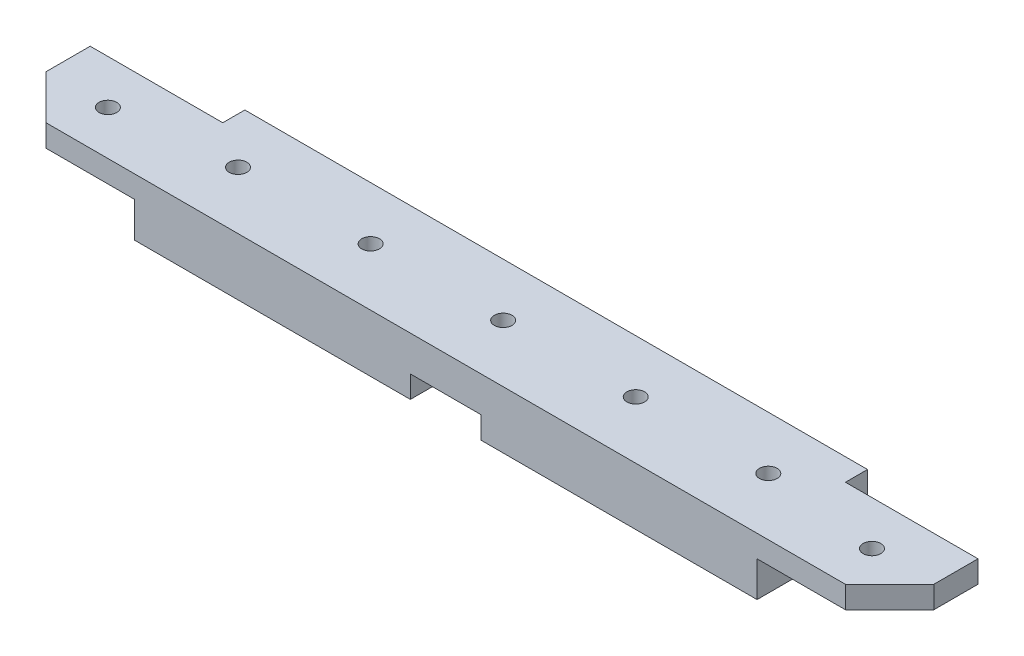
ISO-10303-21;
HEADER;
FILE_DESCRIPTION(('STEP AP214'),'2;1');
FILE_NAME('part.step','',(''),(''),'','','');
FILE_SCHEMA(('AUTOMOTIVE_DESIGN { 1 0 10303 214 1 1 1 1 }'));
ENDSEC;
DATA;
#1=APPLICATION_CONTEXT('core data for automotive mechanical design processes');
#2=APPLICATION_PROTOCOL_DEFINITION('international standard','automotive_design',2000,#1);
#3=PRODUCT_CONTEXT('',#1,'mechanical');
#4=PRODUCT('Part','Part','',(#3));
#5=PRODUCT_RELATED_PRODUCT_CATEGORY('part','',(#4));
#6=PRODUCT_DEFINITION_FORMATION('','',#4);
#7=PRODUCT_DEFINITION_CONTEXT('part definition',#1,'design');
#8=PRODUCT_DEFINITION('design','',#6,#7);
#9=PRODUCT_DEFINITION_SHAPE('','',#8);
#10=(LENGTH_UNIT() NAMED_UNIT(*) SI_UNIT(.MILLI.,.METRE.));
#11=(NAMED_UNIT(*) PLANE_ANGLE_UNIT() SI_UNIT($,.RADIAN.));
#12=(NAMED_UNIT(*) SI_UNIT($,.STERADIAN.) SOLID_ANGLE_UNIT());
#13=UNCERTAINTY_MEASURE_WITH_UNIT(LENGTH_MEASURE(1.E-05),#10,'distance_accuracy_value','');
#14=(GEOMETRIC_REPRESENTATION_CONTEXT(3) GLOBAL_UNCERTAINTY_ASSIGNED_CONTEXT((#13)) GLOBAL_UNIT_ASSIGNED_CONTEXT((#10,
#11,#12)) REPRESENTATION_CONTEXT('',''));
#15=CARTESIAN_POINT('',(0.,0.,0.));
#16=DIRECTION('',(0.,0.,1.));
#17=DIRECTION('',(1.,0.,0.));
#18=AXIS2_PLACEMENT_3D('',#15,#16,#17);
#19=CARTESIAN_POINT('',(70.46,-8.,-13.));
#20=DIRECTION('',(0.,1.,0.));
#21=DIRECTION('',(0.,0.,1.));
#22=AXIS2_PLACEMENT_3D('',#19,#20,#21);
#23=CYLINDRICAL_SURFACE('',#22,2.);
#24=CARTESIAN_POINT('',(70.46,5.,-13.));
#25=DIRECTION('',(0.,1.,0.));
#26=DIRECTION('',(0.,0.,1.));
#27=AXIS2_PLACEMENT_3D('',#24,#25,#26);
#28=CIRCLE('',#27,2.);
#29=CARTESIAN_POINT('',(70.46,5.,-11.));
#30=VERTEX_POINT('',#29);
#31=EDGE_CURVE('E255',#30,#30,#28,.T.);
#32=ORIENTED_EDGE('',*,*,#31,.T.);
#33=EDGE_LOOP('',(#32));
#34=FACE_BOUND('',#33,.T.);
#35=CARTESIAN_POINT('',(70.46,-3.,-13.));
#36=DIRECTION('',(0.,-1.,0.));
#37=DIRECTION('',(0.,0.,-1.));
#38=AXIS2_PLACEMENT_3D('',#35,#36,#37);
#39=CIRCLE('',#38,2.);
#40=CARTESIAN_POINT('',(70.46,-3.,-15.));
#41=VERTEX_POINT('',#40);
#42=EDGE_CURVE('E251',#41,#41,#39,.F.);
#43=ORIENTED_EDGE('',*,*,#42,.F.);
#44=EDGE_LOOP('',(#43));
#45=FACE_BOUND('',#44,.T.);
#46=ADVANCED_FACE('F43',(#34,#45),#23,.F.);
#47=CARTESIAN_POINT('',(130.46,-8.,-13.));
#48=DIRECTION('',(0.,1.,0.));
#49=DIRECTION('',(0.,0.,1.));
#50=AXIS2_PLACEMENT_3D('',#47,#48,#49);
#51=CYLINDRICAL_SURFACE('',#50,2.);
#52=CARTESIAN_POINT('',(130.46,5.,-13.));
#53=DIRECTION('',(0.,1.,0.));
#54=DIRECTION('',(0.,0.,-1.));
#55=AXIS2_PLACEMENT_3D('',#52,#53,#54);
#56=CIRCLE('',#55,2.);
#57=CARTESIAN_POINT('',(130.46,5.,-15.));
#58=VERTEX_POINT('',#57);
#59=EDGE_CURVE('E247',#58,#58,#56,.T.);
#60=ORIENTED_EDGE('',*,*,#59,.T.);
#61=EDGE_LOOP('',(#60));
#62=FACE_BOUND('',#61,.T.);
#63=CARTESIAN_POINT('',(130.46,-3.,-13.));
#64=DIRECTION('',(0.,-1.,0.));
#65=DIRECTION('',(0.,0.,-1.));
#66=AXIS2_PLACEMENT_3D('',#63,#64,#65);
#67=CIRCLE('',#66,2.);
#68=CARTESIAN_POINT('',(130.46,-3.,-15.));
#69=VERTEX_POINT('',#68);
#70=EDGE_CURVE('E347',#69,#69,#67,.F.);
#71=ORIENTED_EDGE('',*,*,#70,.F.);
#72=EDGE_LOOP('',(#71));
#73=FACE_BOUND('',#72,.T.);
#74=ADVANCED_FACE('F443',(#62,#73),#51,.F.);
#75=CARTESIAN_POINT('',(160.46,-8.,-13.));
#76=DIRECTION('',(0.,1.,0.));
#77=DIRECTION('',(0.,0.,1.));
#78=AXIS2_PLACEMENT_3D('',#75,#76,#77);
#79=CYLINDRICAL_SURFACE('',#78,2.);
#80=CARTESIAN_POINT('',(160.46,5.,-13.));
#81=DIRECTION('',(0.,1.,0.));
#82=DIRECTION('',(0.,0.,-1.));
#83=AXIS2_PLACEMENT_3D('',#80,#81,#82);
#84=CIRCLE('',#83,2.);
#85=CARTESIAN_POINT('',(160.46,5.,-15.));
#86=VERTEX_POINT('',#85);
#87=EDGE_CURVE('E250',#86,#86,#84,.T.);
#88=ORIENTED_EDGE('',*,*,#87,.T.);
#89=EDGE_LOOP('',(#88));
#90=FACE_BOUND('',#89,.T.);
#91=CARTESIAN_POINT('',(160.46,-3.,-13.));
#92=DIRECTION('',(0.,-1.,0.));
#93=DIRECTION('',(0.,0.,-1.));
#94=AXIS2_PLACEMENT_3D('',#91,#92,#93);
#95=CIRCLE('',#94,2.);
#96=CARTESIAN_POINT('',(160.46,-3.,-15.));
#97=VERTEX_POINT('',#96);
#98=EDGE_CURVE('E344',#97,#97,#95,.F.);
#99=ORIENTED_EDGE('',*,*,#98,.F.);
#100=EDGE_LOOP('',(#99));
#101=FACE_BOUND('',#100,.T.);
#102=ADVANCED_FACE('F450',(#90,#101),#79,.F.);
#103=CARTESIAN_POINT('',(40.46,-8.,-13.));
#104=DIRECTION('',(0.,1.,0.));
#105=DIRECTION('',(0.,0.,1.));
#106=AXIS2_PLACEMENT_3D('',#103,#104,#105);
#107=CYLINDRICAL_SURFACE('',#106,2.);
#108=CARTESIAN_POINT('',(40.46,5.,-13.));
#109=DIRECTION('',(0.,1.,0.));
#110=DIRECTION('',(0.,0.,1.));
#111=AXIS2_PLACEMENT_3D('',#108,#109,#110);
#112=CIRCLE('',#111,2.);
#113=CARTESIAN_POINT('',(40.46,5.,-11.));
#114=VERTEX_POINT('',#113);
#115=EDGE_CURVE('E252',#114,#114,#112,.T.);
#116=ORIENTED_EDGE('',*,*,#115,.T.);
#117=EDGE_LOOP('',(#116));
#118=FACE_BOUND('',#117,.T.);
#119=CARTESIAN_POINT('',(40.46,-3.,-13.));
#120=DIRECTION('',(0.,-1.,0.));
#121=DIRECTION('',(0.,0.,-1.));
#122=AXIS2_PLACEMENT_3D('',#119,#120,#121);
#123=CIRCLE('',#122,2.);
#124=CARTESIAN_POINT('',(40.46,-3.,-15.));
#125=VERTEX_POINT('',#124);
#126=EDGE_CURVE('E244',#125,#125,#123,.F.);
#127=ORIENTED_EDGE('',*,*,#126,.F.);
#128=EDGE_LOOP('',(#127));
#129=FACE_BOUND('',#128,.T.);
#130=ADVANCED_FACE('F474',(#118,#129),#107,.F.);
#131=CARTESIAN_POINT('',(0.,0.,0.));
#132=DIRECTION('',(0.,-1.,0.));
#133=DIRECTION('',(0.,0.,-1.));
#134=AXIS2_PLACEMENT_3D('',#131,#132,#133);
#135=PLANE('',#134);
#136=CARTESIAN_POINT('',(14.,0.,-10.));
#137=DIRECTION('',(0.,1.,0.));
#138=DIRECTION('',(0.,0.,1.));
#139=AXIS2_PLACEMENT_3D('',#136,#137,#138);
#140=CIRCLE('',#139,2.);
#141=CARTESIAN_POINT('',(14.,0.,-8.));
#142=VERTEX_POINT('',#141);
#143=EDGE_CURVE('E286',#142,#142,#140,.T.);
#144=ORIENTED_EDGE('',*,*,#143,.T.);
#145=EDGE_LOOP('',(#144));
#146=FACE_BOUND('',#145,.T.);
#147=DIRECTION('',(1.,0.,0.));
#148=VECTOR('',#147,1.);
#149=CARTESIAN_POINT('',(0.,0.,0.));
#150=LINE('',#149,#148);
#151=CARTESIAN_POINT('',(10.,0.,0.));
#152=VERTEX_POINT('',#151);
#153=CARTESIAN_POINT('',(30.,0.,0.));
#154=VERTEX_POINT('',#153);
#155=EDGE_CURVE('E320',#152,#154,#150,.T.);
#156=ORIENTED_EDGE('',*,*,#155,.F.);
#157=DIRECTION('',(0.707106781186547,0.,0.707106781186549));
#158=VECTOR('',#157,1.);
#159=CARTESIAN_POINT('',(5.00000000000002,0.,-5.00000000000001));
#160=LINE('',#159,#158);
#161=CARTESIAN_POINT('',(0.,0.,-10.));
#162=VERTEX_POINT('',#161);
#163=EDGE_CURVE('E52',#152,#162,#160,.F.);
#164=ORIENTED_EDGE('',*,*,#163,.T.);
#165=DIRECTION('',(0.,0.,1.));
#166=VECTOR('',#165,1.);
#167=CARTESIAN_POINT('',(0.,0.,0.));
#168=LINE('',#167,#166);
#169=CARTESIAN_POINT('',(0.,0.,-20.));
#170=VERTEX_POINT('',#169);
#171=EDGE_CURVE('E289',#170,#162,#168,.T.);
#172=ORIENTED_EDGE('',*,*,#171,.F.);
#173=DIRECTION('',(-1.,0.,0.));
#174=VECTOR('',#173,1.);
#175=CARTESIAN_POINT('',(0.,0.,-20.));
#176=LINE('',#175,#174);
#177=CARTESIAN_POINT('',(30.,0.,-20.));
#178=VERTEX_POINT('',#177);
#179=EDGE_CURVE('E302',#178,#170,#176,.T.);
#180=ORIENTED_EDGE('',*,*,#179,.F.);
#181=DIRECTION('',(0.,0.,1.));
#182=VECTOR('',#181,1.);
#183=CARTESIAN_POINT('',(30.,0.,-25.));
#184=LINE('',#183,#182);
#185=EDGE_CURVE('E275',#178,#154,#184,.T.);
#186=ORIENTED_EDGE('',*,*,#185,.T.);
#187=EDGE_LOOP('',(#156,#164,#172,#180,#186));
#188=FACE_BOUND('',#187,.T.);
#189=ADVANCED_FACE('F418',(#146,#188),#135,.T.);
#190=CARTESIAN_POINT('',(186.92,0.,-10.));
#191=DIRECTION('',(0.,1.,0.));
#192=DIRECTION('',(0.,0.,1.));
#193=AXIS2_PLACEMENT_3D('',#190,#191,#192);
#194=CIRCLE('',#193,2.);
#195=CARTESIAN_POINT('',(186.92,0.,-8.));
#196=VERTEX_POINT('',#195);
#197=EDGE_CURVE('E293',#196,#196,#194,.T.);
#198=ORIENTED_EDGE('',*,*,#197,.T.);
#199=EDGE_LOOP('',(#198));
#200=FACE_BOUND('',#199,.T.);
#201=DIRECTION('',(0.,0.,-1.));
#202=VECTOR('',#201,1.);
#203=CARTESIAN_POINT('',(200.92,0.,0.));
#204=LINE('',#203,#202);
#205=CARTESIAN_POINT('',(200.92,0.,-10.));
#206=VERTEX_POINT('',#205);
#207=CARTESIAN_POINT('',(200.92,0.,-20.));
#208=VERTEX_POINT('',#207);
#209=EDGE_CURVE('E322',#206,#208,#204,.T.);
#210=ORIENTED_EDGE('',*,*,#209,.F.);
#211=DIRECTION('',(0.707106781186549,0.,-0.707106781186547));
#212=VECTOR('',#211,1.);
#213=CARTESIAN_POINT('',(95.4599999999997,0.,95.46));
#214=LINE('',#213,#212);
#215=CARTESIAN_POINT('',(190.92,0.,0.));
#216=VERTEX_POINT('',#215);
#217=EDGE_CURVE('E354',#206,#216,#214,.F.);
#218=ORIENTED_EDGE('',*,*,#217,.T.);
#219=CARTESIAN_POINT('',(170.92,0.,0.));
#220=VERTEX_POINT('',#219);
#221=EDGE_CURVE('E319',#220,#216,#150,.T.);
#222=ORIENTED_EDGE('',*,*,#221,.F.);
#223=DIRECTION('',(0.,0.,-1.));
#224=VECTOR('',#223,1.);
#225=CARTESIAN_POINT('',(170.92,0.,-25.));
#226=LINE('',#225,#224);
#227=CARTESIAN_POINT('',(170.92,0.,-20.));
#228=VERTEX_POINT('',#227);
#229=EDGE_CURVE('E260',#220,#228,#226,.T.);
#230=ORIENTED_EDGE('',*,*,#229,.T.);
#231=DIRECTION('',(-1.,0.,0.));
#232=VECTOR('',#231,1.);
#233=CARTESIAN_POINT('',(170.92,0.,-20.));
#234=LINE('',#233,#232);
#235=EDGE_CURVE('E324',#208,#228,#234,.T.);
#236=ORIENTED_EDGE('',*,*,#235,.F.);
#237=EDGE_LOOP('',(#210,#218,#222,#230,#236));
#238=FACE_BOUND('',#237,.T.);
#239=ADVANCED_FACE('F381',(#200,#238),#135,.T.);
#240=CARTESIAN_POINT('',(0.,5.,0.));
#241=DIRECTION('',(1.,0.,0.));
#242=DIRECTION('',(0.,0.,-1.));
#243=AXIS2_PLACEMENT_3D('',#240,#241,#242);
#244=PLANE('',#243);
#245=ORIENTED_EDGE('',*,*,#171,.T.);
#246=DIRECTION('',(0.,1.,0.));
#247=VECTOR('',#246,1.);
#248=CARTESIAN_POINT('',(0.,5.,-10.));
#249=LINE('',#248,#247);
#250=CARTESIAN_POINT('',(0.,5.,-10.));
#251=VERTEX_POINT('',#250);
#252=EDGE_CURVE('E11',#162,#251,#249,.T.);
#253=ORIENTED_EDGE('',*,*,#252,.T.);
#254=DIRECTION('',(0.,0.,1.));
#255=VECTOR('',#254,1.);
#256=CARTESIAN_POINT('',(0.,5.,0.));
#257=LINE('',#256,#255);
#258=CARTESIAN_POINT('',(0.,5.,-20.));
#259=VERTEX_POINT('',#258);
#260=EDGE_CURVE('E298',#259,#251,#257,.T.);
#261=ORIENTED_EDGE('',*,*,#260,.F.);
#262=DIRECTION('',(0.,-1.,0.));
#263=VECTOR('',#262,1.);
#264=CARTESIAN_POINT('',(0.,5.,-20.));
#265=LINE('',#264,#263);
#266=EDGE_CURVE('E317',#259,#170,#265,.T.);
#267=ORIENTED_EDGE('',*,*,#266,.T.);
#268=EDGE_LOOP('',(#245,#253,#261,#267));
#269=FACE_BOUND('',#268,.T.);
#270=ADVANCED_FACE('F414',(#269),#244,.F.);
#271=CARTESIAN_POINT('',(0.,5.,0.));
#272=DIRECTION('',(0.,0.,-1.));
#273=DIRECTION('',(-1.,0.,0.));
#274=AXIS2_PLACEMENT_3D('',#271,#272,#273);
#275=PLANE('',#274);
#276=DIRECTION('',(1.,0.,0.));
#277=VECTOR('',#276,1.);
#278=CARTESIAN_POINT('',(30.,-8.,0.));
#279=LINE('',#278,#277);
#280=CARTESIAN_POINT('',(30.,-8.,0.));
#281=VERTEX_POINT('',#280);
#282=CARTESIAN_POINT('',(92.46,-8.,0.));
#283=VERTEX_POINT('',#282);
#284=EDGE_CURVE('E265',#281,#283,#279,.T.);
#285=ORIENTED_EDGE('',*,*,#284,.T.);
#286=DIRECTION('',(0.,-1.,0.));
#287=VECTOR('',#286,1.);
#288=CARTESIAN_POINT('',(92.46,-3.,0.));
#289=LINE('',#288,#287);
#290=CARTESIAN_POINT('',(92.46,-3.,0.));
#291=VERTEX_POINT('',#290);
#292=EDGE_CURVE('E215',#291,#283,#289,.T.);
#293=ORIENTED_EDGE('',*,*,#292,.F.);
#294=DIRECTION('',(-1.,0.,0.));
#295=VECTOR('',#294,1.);
#296=CARTESIAN_POINT('',(92.46,-3.,0.));
#297=LINE('',#296,#295);
#298=CARTESIAN_POINT('',(108.46,-3.,0.));
#299=VERTEX_POINT('',#298);
#300=EDGE_CURVE('E201',#299,#291,#297,.T.);
#301=ORIENTED_EDGE('',*,*,#300,.F.);
#302=DIRECTION('',(0.,-1.,0.));
#303=VECTOR('',#302,1.);
#304=CARTESIAN_POINT('',(108.46,-3.,0.));
#305=LINE('',#304,#303);
#306=CARTESIAN_POINT('',(108.46,-8.,0.));
#307=VERTEX_POINT('',#306);
#308=EDGE_CURVE('E217',#299,#307,#305,.T.);
#309=ORIENTED_EDGE('',*,*,#308,.T.);
#310=CARTESIAN_POINT('',(170.92,-8.,0.));
#311=VERTEX_POINT('',#310);
#312=EDGE_CURVE('E264',#307,#311,#279,.T.);
#313=ORIENTED_EDGE('',*,*,#312,.T.);
#314=DIRECTION('',(0.,1.,0.));
#315=VECTOR('',#314,1.);
#316=CARTESIAN_POINT('',(170.92,-8.,0.));
#317=LINE('',#316,#315);
#318=EDGE_CURVE('E281',#311,#220,#317,.T.);
#319=ORIENTED_EDGE('',*,*,#318,.T.);
#320=ORIENTED_EDGE('',*,*,#221,.T.);
#321=DIRECTION('',(0.,1.,0.));
#322=VECTOR('',#321,1.);
#323=CARTESIAN_POINT('',(190.92,5.,0.));
#324=LINE('',#323,#322);
#325=CARTESIAN_POINT('',(190.92,5.,0.));
#326=VERTEX_POINT('',#325);
#327=EDGE_CURVE('E359',#216,#326,#324,.T.);
#328=ORIENTED_EDGE('',*,*,#327,.T.);
#329=DIRECTION('',(1.,0.,0.));
#330=VECTOR('',#329,1.);
#331=CARTESIAN_POINT('',(0.,5.,0.));
#332=LINE('',#331,#330);
#333=CARTESIAN_POINT('',(10.,5.,0.));
#334=VERTEX_POINT('',#333);
#335=EDGE_CURVE('E301',#334,#326,#332,.T.);
#336=ORIENTED_EDGE('',*,*,#335,.F.);
#337=DIRECTION('',(0.,-1.,0.));
#338=VECTOR('',#337,1.);
#339=CARTESIAN_POINT('',(10.,5.,0.));
#340=LINE('',#339,#338);
#341=EDGE_CURVE('E356',#334,#152,#340,.T.);
#342=ORIENTED_EDGE('',*,*,#341,.T.);
#343=ORIENTED_EDGE('',*,*,#155,.T.);
#344=DIRECTION('',(0.,1.,0.));
#345=VECTOR('',#344,1.);
#346=CARTESIAN_POINT('',(30.,-8.,0.));
#347=LINE('',#346,#345);
#348=EDGE_CURVE('E274',#281,#154,#347,.T.);
#349=ORIENTED_EDGE('',*,*,#348,.F.);
#350=EDGE_LOOP('',(#285,#293,#301,#309,#313,#319,#320,#328,#336,#342,#343,#349));
#351=FACE_BOUND('',#350,.T.);
#352=ADVANCED_FACE('F384',(#351),#275,.F.);
#353=CARTESIAN_POINT('',(200.92,5.,0.));
#354=DIRECTION('',(-1.,0.,0.));
#355=DIRECTION('',(0.,0.,1.));
#356=AXIS2_PLACEMENT_3D('',#353,#354,#355);
#357=PLANE('',#356);
#358=DIRECTION('',(0.,0.,-1.));
#359=VECTOR('',#358,1.);
#360=CARTESIAN_POINT('',(200.92,5.,0.));
#361=LINE('',#360,#359);
#362=CARTESIAN_POINT('',(200.92,5.,-10.));
#363=VERTEX_POINT('',#362);
#364=CARTESIAN_POINT('',(200.92,5.,-20.));
#365=VERTEX_POINT('',#364);
#366=EDGE_CURVE('E305',#363,#365,#361,.T.);
#367=ORIENTED_EDGE('',*,*,#366,.F.);
#368=DIRECTION('',(0.,-1.,0.));
#369=VECTOR('',#368,1.);
#370=CARTESIAN_POINT('',(200.92,5.,-10.));
#371=LINE('',#370,#369);
#372=EDGE_CURVE('E278',#363,#206,#371,.T.);
#373=ORIENTED_EDGE('',*,*,#372,.T.);
#374=ORIENTED_EDGE('',*,*,#209,.T.);
#375=DIRECTION('',(0.,-1.,0.));
#376=VECTOR('',#375,1.);
#377=CARTESIAN_POINT('',(200.92,5.,-20.));
#378=LINE('',#377,#376);
#379=EDGE_CURVE('E279',#365,#208,#378,.T.);
#380=ORIENTED_EDGE('',*,*,#379,.F.);
#381=EDGE_LOOP('',(#367,#373,#374,#380));
#382=FACE_BOUND('',#381,.T.);
#383=ADVANCED_FACE('F374',(#382),#357,.F.);
#384=CARTESIAN_POINT('',(170.92,5.,-20.));
#385=DIRECTION('',(0.,0.,1.));
#386=DIRECTION('',(1.,0.,0.));
#387=AXIS2_PLACEMENT_3D('',#384,#385,#386);
#388=PLANE('',#387);
#389=ORIENTED_EDGE('',*,*,#235,.T.);
#390=DIRECTION('',(0.,-1.,0.));
#391=VECTOR('',#390,1.);
#392=CARTESIAN_POINT('',(170.92,5.,-20.));
#393=LINE('',#392,#391);
#394=CARTESIAN_POINT('',(170.92,5.,-20.));
#395=VERTEX_POINT('',#394);
#396=EDGE_CURVE('E337',#395,#228,#393,.T.);
#397=ORIENTED_EDGE('',*,*,#396,.F.);
#398=DIRECTION('',(-1.,0.,0.));
#399=VECTOR('',#398,1.);
#400=CARTESIAN_POINT('',(170.92,5.,-20.));
#401=LINE('',#400,#399);
#402=EDGE_CURVE('E307',#365,#395,#401,.T.);
#403=ORIENTED_EDGE('',*,*,#402,.F.);
#404=ORIENTED_EDGE('',*,*,#379,.T.);
#405=EDGE_LOOP('',(#389,#397,#403,#404));
#406=FACE_BOUND('',#405,.T.);
#407=ADVANCED_FACE('F394',(#406),#388,.F.);
#408=CARTESIAN_POINT('',(170.92,5.,-20.));
#409=DIRECTION('',(-1.,0.,0.));
#410=DIRECTION('',(0.,0.,1.));
#411=AXIS2_PLACEMENT_3D('',#408,#409,#410);
#412=PLANE('',#411);
#413=ORIENTED_EDGE('',*,*,#396,.T.);
#414=ORIENTED_EDGE('',*,*,#229,.F.);
#415=ORIENTED_EDGE('',*,*,#318,.F.);
#416=DIRECTION('',(0.,0.,-1.));
#417=VECTOR('',#416,1.);
#418=CARTESIAN_POINT('',(170.92,-8.,-25.));
#419=LINE('',#418,#417);
#420=CARTESIAN_POINT('',(170.92,-8.,-25.));
#421=VERTEX_POINT('',#420);
#422=EDGE_CURVE('E268',#311,#421,#419,.T.);
#423=ORIENTED_EDGE('',*,*,#422,.T.);
#424=DIRECTION('',(0.,-1.,0.));
#425=VECTOR('',#424,1.);
#426=CARTESIAN_POINT('',(170.92,5.,-25.));
#427=LINE('',#426,#425);
#428=CARTESIAN_POINT('',(170.92,5.,-25.));
#429=VERTEX_POINT('',#428);
#430=EDGE_CURVE('E335',#429,#421,#427,.T.);
#431=ORIENTED_EDGE('',*,*,#430,.F.);
#432=DIRECTION('',(0.,0.,-1.));
#433=VECTOR('',#432,1.);
#434=CARTESIAN_POINT('',(170.92,5.,-20.));
#435=LINE('',#434,#433);
#436=EDGE_CURVE('E309',#395,#429,#435,.T.);
#437=ORIENTED_EDGE('',*,*,#436,.F.);
#438=EDGE_LOOP('',(#413,#414,#415,#423,#431,#437));
#439=FACE_BOUND('',#438,.T.);
#440=ADVANCED_FACE('F390',(#439),#412,.F.);
#441=CARTESIAN_POINT('',(30.,5.,-25.));
#442=DIRECTION('',(0.,0.,1.));
#443=DIRECTION('',(1.,0.,0.));
#444=AXIS2_PLACEMENT_3D('',#441,#442,#443);
#445=PLANE('',#444);
#446=ORIENTED_EDGE('',*,*,#430,.T.);
#447=DIRECTION('',(-1.,0.,0.));
#448=VECTOR('',#447,1.);
#449=CARTESIAN_POINT('',(30.,-8.,-25.));
#450=LINE('',#449,#448);
#451=CARTESIAN_POINT('',(30.,-8.,-25.));
#452=VERTEX_POINT('',#451);
#453=EDGE_CURVE('E271',#421,#452,#450,.T.);
#454=ORIENTED_EDGE('',*,*,#453,.T.);
#455=DIRECTION('',(0.,-1.,0.));
#456=VECTOR('',#455,1.);
#457=CARTESIAN_POINT('',(30.,5.,-25.));
#458=LINE('',#457,#456);
#459=CARTESIAN_POINT('',(30.,5.,-25.));
#460=VERTEX_POINT('',#459);
#461=EDGE_CURVE('E333',#460,#452,#458,.T.);
#462=ORIENTED_EDGE('',*,*,#461,.F.);
#463=DIRECTION('',(-1.,0.,0.));
#464=VECTOR('',#463,1.);
#465=CARTESIAN_POINT('',(30.,5.,-25.));
#466=LINE('',#465,#464);
#467=EDGE_CURVE('E311',#429,#460,#466,.T.);
#468=ORIENTED_EDGE('',*,*,#467,.F.);
#469=EDGE_LOOP('',(#446,#454,#462,#468));
#470=FACE_BOUND('',#469,.T.);
#471=ADVANCED_FACE('F400',(#470),#445,.F.);
#472=CARTESIAN_POINT('',(30.,5.,-20.));
#473=DIRECTION('',(1.,0.,0.));
#474=DIRECTION('',(0.,0.,-1.));
#475=AXIS2_PLACEMENT_3D('',#472,#473,#474);
#476=PLANE('',#475);
#477=ORIENTED_EDGE('',*,*,#461,.T.);
#478=DIRECTION('',(0.,0.,1.));
#479=VECTOR('',#478,1.);
#480=CARTESIAN_POINT('',(30.,-8.,-25.));
#481=LINE('',#480,#479);
#482=EDGE_CURVE('E261',#452,#281,#481,.T.);
#483=ORIENTED_EDGE('',*,*,#482,.T.);
#484=ORIENTED_EDGE('',*,*,#348,.T.);
#485=ORIENTED_EDGE('',*,*,#185,.F.);
#486=DIRECTION('',(0.,-1.,0.));
#487=VECTOR('',#486,1.);
#488=CARTESIAN_POINT('',(30.,5.,-20.));
#489=LINE('',#488,#487);
#490=CARTESIAN_POINT('',(30.,5.,-20.));
#491=VERTEX_POINT('',#490);
#492=EDGE_CURVE('E330',#491,#178,#489,.T.);
#493=ORIENTED_EDGE('',*,*,#492,.F.);
#494=DIRECTION('',(0.,0.,1.));
#495=VECTOR('',#494,1.);
#496=CARTESIAN_POINT('',(30.,5.,-20.));
#497=LINE('',#496,#495);
#498=EDGE_CURVE('E313',#460,#491,#497,.T.);
#499=ORIENTED_EDGE('',*,*,#498,.F.);
#500=EDGE_LOOP('',(#477,#483,#484,#485,#493,#499));
#501=FACE_BOUND('',#500,.T.);
#502=ADVANCED_FACE('F405',(#501),#476,.F.);
#503=CARTESIAN_POINT('',(0.,5.,-20.));
#504=DIRECTION('',(0.,0.,1.));
#505=DIRECTION('',(1.,0.,0.));
#506=AXIS2_PLACEMENT_3D('',#503,#504,#505);
#507=PLANE('',#506);
#508=ORIENTED_EDGE('',*,*,#179,.T.);
#509=ORIENTED_EDGE('',*,*,#266,.F.);
#510=DIRECTION('',(-1.,0.,0.));
#511=VECTOR('',#510,1.);
#512=CARTESIAN_POINT('',(0.,5.,-20.));
#513=LINE('',#512,#511);
#514=EDGE_CURVE('E315',#491,#259,#513,.T.);
#515=ORIENTED_EDGE('',*,*,#514,.F.);
#516=ORIENTED_EDGE('',*,*,#492,.T.);
#517=EDGE_LOOP('',(#508,#509,#515,#516));
#518=FACE_BOUND('',#517,.T.);
#519=ADVANCED_FACE('F411',(#518),#507,.F.);
#520=CARTESIAN_POINT('',(0.,5.,0.));
#521=DIRECTION('',(0.,-1.,0.));
#522=DIRECTION('',(0.,0.,-1.));
#523=AXIS2_PLACEMENT_3D('',#520,#521,#522);
#524=PLANE('',#523);
#525=CARTESIAN_POINT('',(100.46,5.,-13.));
#526=DIRECTION('',(0.,-1.,0.));
#527=DIRECTION('',(0.,0.,-1.));
#528=AXIS2_PLACEMENT_3D('',#525,#526,#527);
#529=CIRCLE('',#528,2.);
#530=CARTESIAN_POINT('',(100.46,5.,-15.));
#531=VERTEX_POINT('',#530);
#532=EDGE_CURVE('E206',#531,#531,#529,.T.);
#533=ORIENTED_EDGE('',*,*,#532,.T.);
#534=EDGE_LOOP('',(#533));
#535=FACE_BOUND('',#534,.T.);
#536=ORIENTED_EDGE('',*,*,#115,.F.);
#537=EDGE_LOOP('',(#536));
#538=FACE_BOUND('',#537,.T.);
#539=ORIENTED_EDGE('',*,*,#87,.F.);
#540=EDGE_LOOP('',(#539));
#541=FACE_BOUND('',#540,.T.);
#542=ORIENTED_EDGE('',*,*,#59,.F.);
#543=EDGE_LOOP('',(#542));
#544=FACE_BOUND('',#543,.T.);
#545=ORIENTED_EDGE('',*,*,#31,.F.);
#546=EDGE_LOOP('',(#545));
#547=FACE_BOUND('',#546,.T.);
#548=CARTESIAN_POINT('',(14.,5.,-10.));
#549=DIRECTION('',(0.,1.,0.));
#550=DIRECTION('',(0.,0.,1.));
#551=AXIS2_PLACEMENT_3D('',#548,#549,#550);
#552=CIRCLE('',#551,2.);
#553=CARTESIAN_POINT('',(14.,5.,-8.));
#554=VERTEX_POINT('',#553);
#555=EDGE_CURVE('E290',#554,#554,#552,.T.);
#556=ORIENTED_EDGE('',*,*,#555,.F.);
#557=EDGE_LOOP('',(#556));
#558=FACE_BOUND('',#557,.T.);
#559=CARTESIAN_POINT('',(186.92,5.,-10.));
#560=DIRECTION('',(0.,1.,0.));
#561=DIRECTION('',(0.,0.,1.));
#562=AXIS2_PLACEMENT_3D('',#559,#560,#561);
#563=CIRCLE('',#562,2.);
#564=CARTESIAN_POINT('',(186.92,5.,-8.));
#565=VERTEX_POINT('',#564);
#566=EDGE_CURVE('E283',#565,#565,#563,.T.);
#567=ORIENTED_EDGE('',*,*,#566,.F.);
#568=EDGE_LOOP('',(#567));
#569=FACE_BOUND('',#568,.T.);
#570=ORIENTED_EDGE('',*,*,#335,.T.);
#571=DIRECTION('',(-0.707106781186549,0.,0.707106781186547));
#572=VECTOR('',#571,1.);
#573=CARTESIAN_POINT('',(200.92,5.,-10.));
#574=LINE('',#573,#572);
#575=EDGE_CURVE('E363',#326,#363,#574,.F.);
#576=ORIENTED_EDGE('',*,*,#575,.T.);
#577=ORIENTED_EDGE('',*,*,#366,.T.);
#578=ORIENTED_EDGE('',*,*,#402,.T.);
#579=ORIENTED_EDGE('',*,*,#436,.T.);
#580=ORIENTED_EDGE('',*,*,#467,.T.);
#581=ORIENTED_EDGE('',*,*,#498,.T.);
#582=ORIENTED_EDGE('',*,*,#514,.T.);
#583=ORIENTED_EDGE('',*,*,#260,.T.);
#584=DIRECTION('',(-0.707106781186547,0.,-0.707106781186549));
#585=VECTOR('',#584,1.);
#586=CARTESIAN_POINT('',(10.,5.,0.));
#587=LINE('',#586,#585);
#588=EDGE_CURVE('E361',#251,#334,#587,.F.);
#589=ORIENTED_EDGE('',*,*,#588,.T.);
#590=EDGE_LOOP('',(#570,#576,#577,#578,#579,#580,#581,#582,#583,#589));
#591=FACE_BOUND('',#590,.T.);
#592=ADVANCED_FACE('F367',(#535,#538,#541,#544,#547,#558,#569,#591),#524,.F.);
#593=CARTESIAN_POINT('',(186.92,0.,-10.));
#594=DIRECTION('',(0.,1.,0.));
#595=DIRECTION('',(0.,0.,1.));
#596=AXIS2_PLACEMENT_3D('',#593,#594,#595);
#597=CYLINDRICAL_SURFACE('',#596,2.);
#598=ORIENTED_EDGE('',*,*,#197,.F.);
#599=EDGE_LOOP('',(#598));
#600=FACE_BOUND('',#599,.T.);
#601=ORIENTED_EDGE('',*,*,#566,.T.);
#602=EDGE_LOOP('',(#601));
#603=FACE_BOUND('',#602,.T.);
#604=ADVANCED_FACE('F464',(#600,#603),#597,.F.);
#605=CARTESIAN_POINT('',(14.,0.,-10.));
#606=DIRECTION('',(0.,1.,0.));
#607=DIRECTION('',(0.,0.,1.));
#608=AXIS2_PLACEMENT_3D('',#605,#606,#607);
#609=CYLINDRICAL_SURFACE('',#608,2.);
#610=ORIENTED_EDGE('',*,*,#143,.F.);
#611=EDGE_LOOP('',(#610));
#612=FACE_BOUND('',#611,.T.);
#613=ORIENTED_EDGE('',*,*,#555,.T.);
#614=EDGE_LOOP('',(#613));
#615=FACE_BOUND('',#614,.T.);
#616=ADVANCED_FACE('F460',(#612,#615),#609,.F.);
#617=CARTESIAN_POINT('',(0.,-8.,0.));
#618=DIRECTION('',(0.,1.,0.));
#619=DIRECTION('',(0.,0.,1.));
#620=AXIS2_PLACEMENT_3D('',#617,#618,#619);
#621=PLANE('',#620);
#622=CARTESIAN_POINT('',(40.46,-8.,-13.));
#623=DIRECTION('',(0.,-1.,0.));
#624=DIRECTION('',(0.,0.,-1.));
#625=AXIS2_PLACEMENT_3D('',#622,#623,#624);
#626=CIRCLE('',#625,4.00000000000001);
#627=CARTESIAN_POINT('',(40.46,-8.,-17.));
#628=VERTEX_POINT('',#627);
#629=EDGE_CURVE('E214',#628,#628,#626,.T.);
#630=ORIENTED_EDGE('',*,*,#629,.F.);
#631=EDGE_LOOP('',(#630));
#632=FACE_BOUND('',#631,.T.);
#633=CARTESIAN_POINT('',(160.46,-8.,-13.));
#634=DIRECTION('',(0.,-1.,0.));
#635=DIRECTION('',(0.,0.,-1.));
#636=AXIS2_PLACEMENT_3D('',#633,#634,#635);
#637=CIRCLE('',#636,3.99999999999999);
#638=CARTESIAN_POINT('',(160.46,-8.,-17.));
#639=VERTEX_POINT('',#638);
#640=EDGE_CURVE('E233',#639,#639,#637,.T.);
#641=ORIENTED_EDGE('',*,*,#640,.F.);
#642=EDGE_LOOP('',(#641));
#643=FACE_BOUND('',#642,.T.);
#644=CARTESIAN_POINT('',(130.46,-8.,-13.));
#645=DIRECTION('',(0.,-1.,0.));
#646=DIRECTION('',(0.,0.,-1.));
#647=AXIS2_PLACEMENT_3D('',#644,#645,#646);
#648=CIRCLE('',#647,3.99999999999999);
#649=CARTESIAN_POINT('',(130.46,-8.,-17.));
#650=VERTEX_POINT('',#649);
#651=EDGE_CURVE('E227',#650,#650,#648,.T.);
#652=ORIENTED_EDGE('',*,*,#651,.F.);
#653=EDGE_LOOP('',(#652));
#654=FACE_BOUND('',#653,.T.);
#655=CARTESIAN_POINT('',(70.46,-8.,-13.));
#656=DIRECTION('',(0.,-1.,0.));
#657=DIRECTION('',(0.,0.,-1.));
#658=AXIS2_PLACEMENT_3D('',#655,#656,#657);
#659=CIRCLE('',#658,4.00000000000001);
#660=CARTESIAN_POINT('',(70.46,-8.,-17.));
#661=VERTEX_POINT('',#660);
#662=EDGE_CURVE('E226',#661,#661,#659,.T.);
#663=ORIENTED_EDGE('',*,*,#662,.F.);
#664=EDGE_LOOP('',(#663));
#665=FACE_BOUND('',#664,.T.);
#666=DIRECTION('',(0.499999999999999,0.,-0.866025403784439));
#667=VECTOR('',#666,1.);
#668=CARTESIAN_POINT('',(92.46,-8.,-10.0717967697245));
#669=LINE('',#668,#667);
#670=CARTESIAN_POINT('',(92.46,-8.,-10.0717967697245));
#671=VERTEX_POINT('',#670);
#672=CARTESIAN_POINT('',(96.46,-8.,-17.));
#673=VERTEX_POINT('',#672);
#674=EDGE_CURVE('E59',#671,#673,#669,.T.);
#675=ORIENTED_EDGE('',*,*,#674,.F.);
#676=DIRECTION('',(0.,0.,-1.));
#677=VECTOR('',#676,1.);
#678=CARTESIAN_POINT('',(92.46,-8.,-10.0717967697245));
#679=LINE('',#678,#677);
#680=EDGE_CURVE('E188',#283,#671,#679,.T.);
#681=ORIENTED_EDGE('',*,*,#680,.F.);
#682=ORIENTED_EDGE('',*,*,#284,.F.);
#683=ORIENTED_EDGE('',*,*,#482,.F.);
#684=ORIENTED_EDGE('',*,*,#453,.F.);
#685=ORIENTED_EDGE('',*,*,#422,.F.);
#686=ORIENTED_EDGE('',*,*,#312,.F.);
#687=DIRECTION('',(0.,0.,1.));
#688=VECTOR('',#687,1.);
#689=CARTESIAN_POINT('',(108.46,-8.,-10.0717967697245));
#690=LINE('',#689,#688);
#691=CARTESIAN_POINT('',(108.46,-8.,-10.0717967697245));
#692=VERTEX_POINT('',#691);
#693=EDGE_CURVE('E191',#692,#307,#690,.T.);
#694=ORIENTED_EDGE('',*,*,#693,.F.);
#695=DIRECTION('',(0.500000000000001,0.,0.866025403784438));
#696=VECTOR('',#695,1.);
#697=CARTESIAN_POINT('',(104.46,-8.,-17.));
#698=LINE('',#697,#696);
#699=CARTESIAN_POINT('',(104.46,-8.,-17.));
#700=VERTEX_POINT('',#699);
#701=EDGE_CURVE('E208',#700,#692,#698,.T.);
#702=ORIENTED_EDGE('',*,*,#701,.F.);
#703=DIRECTION('',(1.,0.,0.));
#704=VECTOR('',#703,1.);
#705=CARTESIAN_POINT('',(96.46,-8.,-17.));
#706=LINE('',#705,#704);
#707=EDGE_CURVE('E205',#673,#700,#706,.T.);
#708=ORIENTED_EDGE('',*,*,#707,.F.);
#709=EDGE_LOOP('',(#675,#681,#682,#683,#684,#685,#686,#694,#702,#708));
#710=FACE_BOUND('',#709,.T.);
#711=ADVANCED_FACE('F423',(#632,#643,#654,#665,#710),#621,.F.);
#712=CARTESIAN_POINT('',(40.46,-3.,-13.));
#713=DIRECTION('',(0.,-1.,0.));
#714=DIRECTION('',(0.,0.,-1.));
#715=AXIS2_PLACEMENT_3D('',#712,#713,#714);
#716=PLANE('',#715);
#717=CARTESIAN_POINT('',(40.46,-3.,-13.));
#718=DIRECTION('',(0.,-1.,0.));
#719=DIRECTION('',(0.,0.,-1.));
#720=AXIS2_PLACEMENT_3D('',#717,#718,#719);
#721=CIRCLE('',#720,4.00000000000001);
#722=CARTESIAN_POINT('',(40.46,-3.,-17.));
#723=VERTEX_POINT('',#722);
#724=EDGE_CURVE('E236',#723,#723,#721,.T.);
#725=ORIENTED_EDGE('',*,*,#724,.T.);
#726=EDGE_LOOP('',(#725));
#727=FACE_BOUND('',#726,.T.);
#728=ORIENTED_EDGE('',*,*,#126,.T.);
#729=EDGE_LOOP('',(#728));
#730=FACE_BOUND('',#729,.T.);
#731=ADVANCED_FACE('F459',(#727,#730),#716,.T.);
#732=CARTESIAN_POINT('',(40.46,-3.,-13.));
#733=DIRECTION('',(0.,-1.,0.));
#734=DIRECTION('',(0.,0.,-1.));
#735=AXIS2_PLACEMENT_3D('',#732,#733,#734);
#736=CYLINDRICAL_SURFACE('',#735,4.00000000000001);
#737=ORIENTED_EDGE('',*,*,#724,.F.);
#738=EDGE_LOOP('',(#737));
#739=FACE_BOUND('',#738,.T.);
#740=ORIENTED_EDGE('',*,*,#629,.T.);
#741=EDGE_LOOP('',(#740));
#742=FACE_BOUND('',#741,.T.);
#743=ADVANCED_FACE('F525',(#739,#742),#736,.F.);
#744=CARTESIAN_POINT('',(160.46,-3.,-13.));
#745=DIRECTION('',(0.,-1.,0.));
#746=DIRECTION('',(0.,0.,-1.));
#747=AXIS2_PLACEMENT_3D('',#744,#745,#746);
#748=PLANE('',#747);
#749=CARTESIAN_POINT('',(160.46,-3.,-13.));
#750=DIRECTION('',(0.,-1.,0.));
#751=DIRECTION('',(0.,0.,-1.));
#752=AXIS2_PLACEMENT_3D('',#749,#750,#751);
#753=CIRCLE('',#752,3.99999999999999);
#754=CARTESIAN_POINT('',(160.46,-3.,-17.));
#755=VERTEX_POINT('',#754);
#756=EDGE_CURVE('E230',#755,#755,#753,.T.);
#757=ORIENTED_EDGE('',*,*,#756,.T.);
#758=EDGE_LOOP('',(#757));
#759=FACE_BOUND('',#758,.T.);
#760=ORIENTED_EDGE('',*,*,#98,.T.);
#761=EDGE_LOOP('',(#760));
#762=FACE_BOUND('',#761,.T.);
#763=ADVANCED_FACE('F531',(#759,#762),#748,.T.);
#764=CARTESIAN_POINT('',(160.46,-3.,-13.));
#765=DIRECTION('',(0.,-1.,0.));
#766=DIRECTION('',(0.,0.,-1.));
#767=AXIS2_PLACEMENT_3D('',#764,#765,#766);
#768=CYLINDRICAL_SURFACE('',#767,3.99999999999999);
#769=ORIENTED_EDGE('',*,*,#756,.F.);
#770=EDGE_LOOP('',(#769));
#771=FACE_BOUND('',#770,.T.);
#772=ORIENTED_EDGE('',*,*,#640,.T.);
#773=EDGE_LOOP('',(#772));
#774=FACE_BOUND('',#773,.T.);
#775=ADVANCED_FACE('F534',(#771,#774),#768,.F.);
#776=CARTESIAN_POINT('',(130.46,-3.,-13.));
#777=DIRECTION('',(0.,-1.,0.));
#778=DIRECTION('',(0.,0.,-1.));
#779=AXIS2_PLACEMENT_3D('',#776,#777,#778);
#780=PLANE('',#779);
#781=CARTESIAN_POINT('',(130.46,-3.,-13.));
#782=DIRECTION('',(0.,-1.,0.));
#783=DIRECTION('',(0.,0.,-1.));
#784=AXIS2_PLACEMENT_3D('',#781,#782,#783);
#785=CIRCLE('',#784,3.99999999999999);
#786=CARTESIAN_POINT('',(130.46,-3.,-17.));
#787=VERTEX_POINT('',#786);
#788=EDGE_CURVE('E223',#787,#787,#785,.T.);
#789=ORIENTED_EDGE('',*,*,#788,.T.);
#790=EDGE_LOOP('',(#789));
#791=FACE_BOUND('',#790,.T.);
#792=ORIENTED_EDGE('',*,*,#70,.T.);
#793=EDGE_LOOP('',(#792));
#794=FACE_BOUND('',#793,.T.);
#795=ADVANCED_FACE('F537',(#791,#794),#780,.T.);
#796=CARTESIAN_POINT('',(130.46,-3.,-13.));
#797=DIRECTION('',(0.,-1.,0.));
#798=DIRECTION('',(0.,0.,-1.));
#799=AXIS2_PLACEMENT_3D('',#796,#797,#798);
#800=CYLINDRICAL_SURFACE('',#799,3.99999999999999);
#801=ORIENTED_EDGE('',*,*,#788,.F.);
#802=EDGE_LOOP('',(#801));
#803=FACE_BOUND('',#802,.T.);
#804=ORIENTED_EDGE('',*,*,#651,.T.);
#805=EDGE_LOOP('',(#804));
#806=FACE_BOUND('',#805,.T.);
#807=ADVANCED_FACE('F508',(#803,#806),#800,.F.);
#808=CARTESIAN_POINT('',(70.46,-3.,-13.));
#809=DIRECTION('',(0.,-1.,0.));
#810=DIRECTION('',(0.,0.,-1.));
#811=AXIS2_PLACEMENT_3D('',#808,#809,#810);
#812=PLANE('',#811);
#813=CARTESIAN_POINT('',(70.46,-3.,-13.));
#814=DIRECTION('',(0.,-1.,0.));
#815=DIRECTION('',(0.,0.,-1.));
#816=AXIS2_PLACEMENT_3D('',#813,#814,#815);
#817=CIRCLE('',#816,4.00000000000001);
#818=CARTESIAN_POINT('',(70.46,-3.,-17.));
#819=VERTEX_POINT('',#818);
#820=EDGE_CURVE('E241',#819,#819,#817,.T.);
#821=ORIENTED_EDGE('',*,*,#820,.T.);
#822=EDGE_LOOP('',(#821));
#823=FACE_BOUND('',#822,.T.);
#824=ORIENTED_EDGE('',*,*,#42,.T.);
#825=EDGE_LOOP('',(#824));
#826=FACE_BOUND('',#825,.T.);
#827=ADVANCED_FACE('F501',(#823,#826),#812,.T.);
#828=CARTESIAN_POINT('',(70.46,-3.,-13.));
#829=DIRECTION('',(0.,-1.,0.));
#830=DIRECTION('',(0.,0.,-1.));
#831=AXIS2_PLACEMENT_3D('',#828,#829,#830);
#832=CYLINDRICAL_SURFACE('',#831,4.00000000000001);
#833=ORIENTED_EDGE('',*,*,#820,.F.);
#834=EDGE_LOOP('',(#833));
#835=FACE_BOUND('',#834,.T.);
#836=ORIENTED_EDGE('',*,*,#662,.T.);
#837=EDGE_LOOP('',(#836));
#838=FACE_BOUND('',#837,.T.);
#839=ADVANCED_FACE('F495',(#835,#838),#832,.F.);
#840=CARTESIAN_POINT('',(200.92,5.,-10.));
#841=DIRECTION('',(-0.707106781186547,0.,-0.707106781186549));
#842=DIRECTION('',(0.,-1.,0.));
#843=AXIS2_PLACEMENT_3D('',#840,#841,#842);
#844=PLANE('',#843);
#845=ORIENTED_EDGE('',*,*,#575,.F.);
#846=ORIENTED_EDGE('',*,*,#327,.F.);
#847=ORIENTED_EDGE('',*,*,#217,.F.);
#848=ORIENTED_EDGE('',*,*,#372,.F.);
#849=EDGE_LOOP('',(#845,#846,#847,#848));
#850=FACE_BOUND('',#849,.T.);
#851=ADVANCED_FACE('F377',(#850),#844,.F.);
#852=CARTESIAN_POINT('',(10.,5.,0.));
#853=DIRECTION('',(0.707106781186549,0.,-0.707106781186547));
#854=DIRECTION('',(0.,-1.,0.));
#855=AXIS2_PLACEMENT_3D('',#852,#853,#854);
#856=PLANE('',#855);
#857=ORIENTED_EDGE('',*,*,#588,.F.);
#858=ORIENTED_EDGE('',*,*,#252,.F.);
#859=ORIENTED_EDGE('',*,*,#163,.F.);
#860=ORIENTED_EDGE('',*,*,#341,.F.);
#861=EDGE_LOOP('',(#857,#858,#859,#860));
#862=FACE_BOUND('',#861,.T.);
#863=ADVANCED_FACE('F46',(#862),#856,.F.);
#864=CARTESIAN_POINT('',(92.46,-3.,-10.0717967697245));
#865=DIRECTION('',(-0.866025403784439,0.,-0.499999999999999));
#866=DIRECTION('',(-0.499999999999999,0.,0.866025403784439));
#867=AXIS2_PLACEMENT_3D('',#864,#865,#866);
#868=PLANE('',#867);
#869=ORIENTED_EDGE('',*,*,#674,.T.);
#870=DIRECTION('',(0.,-1.,0.));
#871=VECTOR('',#870,1.);
#872=CARTESIAN_POINT('',(96.46,-3.,-17.));
#873=LINE('',#872,#871);
#874=CARTESIAN_POINT('',(96.46,-3.,-17.));
#875=VERTEX_POINT('',#874);
#876=EDGE_CURVE('E166',#875,#673,#873,.T.);
#877=ORIENTED_EDGE('',*,*,#876,.F.);
#878=DIRECTION('',(0.499999999999999,0.,-0.866025403784439));
#879=VECTOR('',#878,1.);
#880=CARTESIAN_POINT('',(92.46,-3.,-10.0717967697245));
#881=LINE('',#880,#879);
#882=CARTESIAN_POINT('',(92.46,-3.,-10.0717967697245));
#883=VERTEX_POINT('',#882);
#884=EDGE_CURVE('E170',#883,#875,#881,.T.);
#885=ORIENTED_EDGE('',*,*,#884,.F.);
#886=DIRECTION('',(0.,-1.,0.));
#887=VECTOR('',#886,1.);
#888=CARTESIAN_POINT('',(92.46,-3.,-10.0717967697245));
#889=LINE('',#888,#887);
#890=EDGE_CURVE('E212',#883,#671,#889,.T.);
#891=ORIENTED_EDGE('',*,*,#890,.T.);
#892=EDGE_LOOP('',(#869,#877,#885,#891));
#893=FACE_BOUND('',#892,.T.);
#894=ADVANCED_FACE('F168',(#893),#868,.F.);
#895=CARTESIAN_POINT('',(92.46,-3.,-10.0717967697245));
#896=DIRECTION('',(-1.,0.,0.));
#897=DIRECTION('',(0.,0.,1.));
#898=AXIS2_PLACEMENT_3D('',#895,#896,#897);
#899=PLANE('',#898);
#900=ORIENTED_EDGE('',*,*,#680,.T.);
#901=ORIENTED_EDGE('',*,*,#890,.F.);
#902=DIRECTION('',(0.,0.,-1.));
#903=VECTOR('',#902,1.);
#904=CARTESIAN_POINT('',(92.46,-3.,-10.0717967697245));
#905=LINE('',#904,#903);
#906=EDGE_CURVE('E176',#291,#883,#905,.T.);
#907=ORIENTED_EDGE('',*,*,#906,.F.);
#908=ORIENTED_EDGE('',*,*,#292,.T.);
#909=EDGE_LOOP('',(#900,#901,#907,#908));
#910=FACE_BOUND('',#909,.T.);
#911=ADVANCED_FACE('F425',(#910),#899,.F.);
#912=CARTESIAN_POINT('',(108.46,-3.,-10.0717967697245));
#913=DIRECTION('',(1.,0.,0.));
#914=DIRECTION('',(0.,0.,-1.));
#915=AXIS2_PLACEMENT_3D('',#912,#913,#914);
#916=PLANE('',#915);
#917=ORIENTED_EDGE('',*,*,#693,.T.);
#918=ORIENTED_EDGE('',*,*,#308,.F.);
#919=DIRECTION('',(0.,0.,1.));
#920=VECTOR('',#919,1.);
#921=CARTESIAN_POINT('',(108.46,-3.,-10.0717967697245));
#922=LINE('',#921,#920);
#923=CARTESIAN_POINT('',(108.46,-3.,-10.0717967697245));
#924=VERTEX_POINT('',#923);
#925=EDGE_CURVE('E198',#924,#299,#922,.T.);
#926=ORIENTED_EDGE('',*,*,#925,.F.);
#927=DIRECTION('',(0.,-1.,0.));
#928=VECTOR('',#927,1.);
#929=CARTESIAN_POINT('',(108.46,-3.,-10.0717967697245));
#930=LINE('',#929,#928);
#931=EDGE_CURVE('E220',#924,#692,#930,.T.);
#932=ORIENTED_EDGE('',*,*,#931,.T.);
#933=EDGE_LOOP('',(#917,#918,#926,#932));
#934=FACE_BOUND('',#933,.T.);
#935=ADVANCED_FACE('F429',(#934),#916,.F.);
#936=CARTESIAN_POINT('',(104.46,-3.,-17.));
#937=DIRECTION('',(0.866025403784438,0.,-0.500000000000001));
#938=DIRECTION('',(-0.500000000000001,0.,-0.866025403784438));
#939=AXIS2_PLACEMENT_3D('',#936,#937,#938);
#940=PLANE('',#939);
#941=ORIENTED_EDGE('',*,*,#701,.T.);
#942=ORIENTED_EDGE('',*,*,#931,.F.);
#943=DIRECTION('',(0.500000000000001,0.,0.866025403784438));
#944=VECTOR('',#943,1.);
#945=CARTESIAN_POINT('',(104.46,-3.,-17.));
#946=LINE('',#945,#944);
#947=CARTESIAN_POINT('',(104.46,-3.,-17.));
#948=VERTEX_POINT('',#947);
#949=EDGE_CURVE('E184',#948,#924,#946,.T.);
#950=ORIENTED_EDGE('',*,*,#949,.F.);
#951=DIRECTION('',(0.,-1.,0.));
#952=VECTOR('',#951,1.);
#953=CARTESIAN_POINT('',(104.46,-3.,-17.));
#954=LINE('',#953,#952);
#955=EDGE_CURVE('E175',#948,#700,#954,.T.);
#956=ORIENTED_EDGE('',*,*,#955,.T.);
#957=EDGE_LOOP('',(#941,#942,#950,#956));
#958=FACE_BOUND('',#957,.T.);
#959=ADVANCED_FACE('F433',(#958),#940,.F.);
#960=CARTESIAN_POINT('',(96.46,-3.,-17.));
#961=DIRECTION('',(0.,0.,-1.));
#962=DIRECTION('',(-1.,0.,0.));
#963=AXIS2_PLACEMENT_3D('',#960,#961,#962);
#964=PLANE('',#963);
#965=ORIENTED_EDGE('',*,*,#707,.T.);
#966=ORIENTED_EDGE('',*,*,#955,.F.);
#967=DIRECTION('',(1.,0.,0.));
#968=VECTOR('',#967,1.);
#969=CARTESIAN_POINT('',(96.46,-3.,-17.));
#970=LINE('',#969,#968);
#971=EDGE_CURVE('E179',#875,#948,#970,.T.);
#972=ORIENTED_EDGE('',*,*,#971,.F.);
#973=ORIENTED_EDGE('',*,*,#876,.T.);
#974=EDGE_LOOP('',(#965,#966,#972,#973));
#975=FACE_BOUND('',#974,.T.);
#976=ADVANCED_FACE('F180',(#975),#964,.F.);
#977=CARTESIAN_POINT('',(0.,-3.,0.));
#978=DIRECTION('',(0.,-1.,0.));
#979=DIRECTION('',(0.,0.,-1.));
#980=AXIS2_PLACEMENT_3D('',#977,#978,#979);
#981=PLANE('',#980);
#982=CARTESIAN_POINT('',(100.46,-3.,-13.));
#983=DIRECTION('',(0.,-1.,0.));
#984=DIRECTION('',(0.,0.,-1.));
#985=AXIS2_PLACEMENT_3D('',#982,#983,#984);
#986=CIRCLE('',#985,2.);
#987=CARTESIAN_POINT('',(100.46,-3.,-15.));
#988=VERTEX_POINT('',#987);
#989=EDGE_CURVE('E194',#988,#988,#986,.T.);
#990=ORIENTED_EDGE('',*,*,#989,.F.);
#991=EDGE_LOOP('',(#990));
#992=FACE_BOUND('',#991,.T.);
#993=ORIENTED_EDGE('',*,*,#884,.T.);
#994=ORIENTED_EDGE('',*,*,#971,.T.);
#995=ORIENTED_EDGE('',*,*,#949,.T.);
#996=ORIENTED_EDGE('',*,*,#925,.T.);
#997=ORIENTED_EDGE('',*,*,#300,.T.);
#998=ORIENTED_EDGE('',*,*,#906,.T.);
#999=EDGE_LOOP('',(#993,#994,#995,#996,#997,#998));
#1000=FACE_BOUND('',#999,.T.);
#1001=ADVANCED_FACE('F186',(#992,#1000),#981,.T.);
#1002=CARTESIAN_POINT('',(100.46,5.,-13.));
#1003=DIRECTION('',(0.,-1.,0.));
#1004=DIRECTION('',(0.,0.,-1.));
#1005=AXIS2_PLACEMENT_3D('',#1002,#1003,#1004);
#1006=CYLINDRICAL_SURFACE('',#1005,2.);
#1007=ORIENTED_EDGE('',*,*,#532,.F.);
#1008=EDGE_LOOP('',(#1007));
#1009=FACE_BOUND('',#1008,.T.);
#1010=ORIENTED_EDGE('',*,*,#989,.T.);
#1011=EDGE_LOOP('',(#1010));
#1012=FACE_BOUND('',#1011,.T.);
#1013=ADVANCED_FACE('F558',(#1009,#1012),#1006,.F.);
#1014=CLOSED_SHELL('',(#46,#74,#102,#130,#189,#239,#270,#352,#383,#407,#440,#471,#502,#519,#592,
#604,#616,#711,#731,#743,#763,#775,#795,#807,#827,#839,#851,#863,#894,#911,#935,#959,#976,#1001,#1013));
#1015=MANIFOLD_SOLID_BREP('B2',#1014);
#1016=ADVANCED_BREP_SHAPE_REPRESENTATION('',(#18,#1015),#14);
#1017=SHAPE_DEFINITION_REPRESENTATION(#9,#1016);
ENDSEC;
END-ISO-10303-21;
